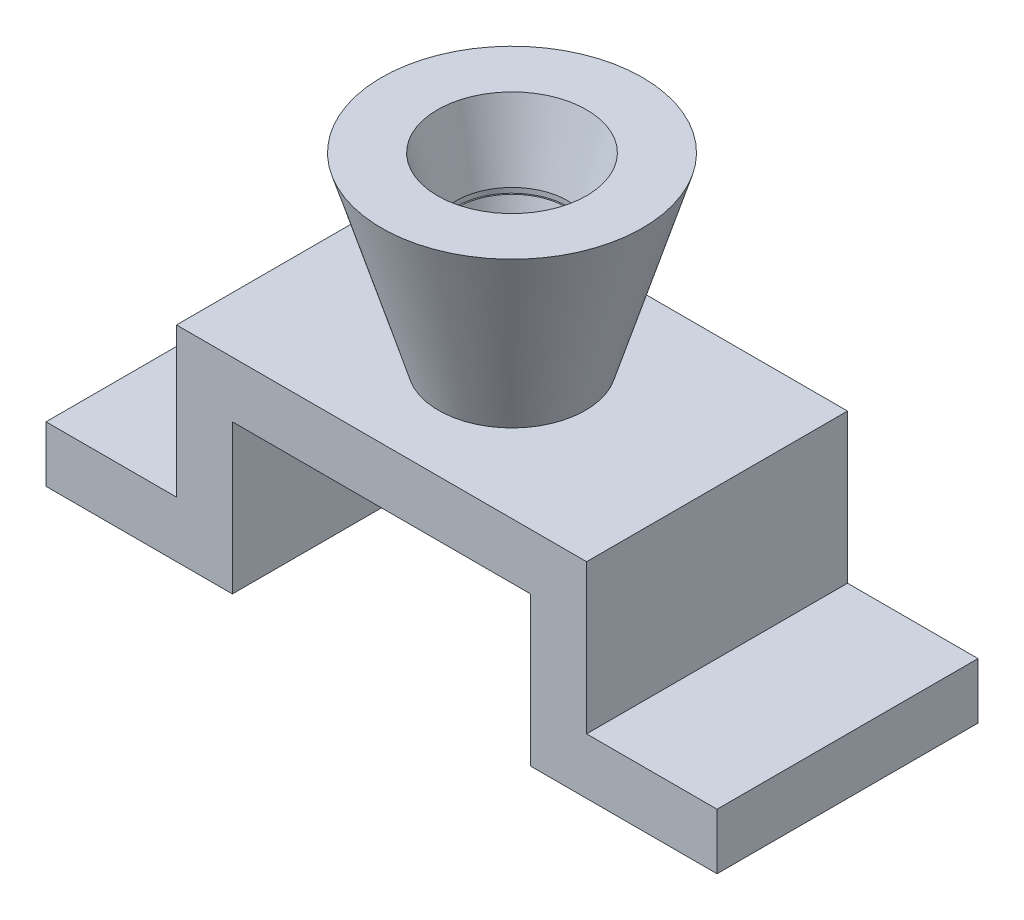
ISO-10303-21;
HEADER;
FILE_DESCRIPTION(('STEP AP214'),'2;1');
FILE_NAME('part.step','',(''),(''),'','','');
FILE_SCHEMA(('AUTOMOTIVE_DESIGN { 1 0 10303 214 1 1 1 1 }'));
ENDSEC;
DATA;
#1=APPLICATION_CONTEXT('core data for automotive mechanical design processes');
#2=APPLICATION_PROTOCOL_DEFINITION('international standard','automotive_design',2000,#1);
#3=PRODUCT_CONTEXT('',#1,'mechanical');
#4=PRODUCT('Part','Part','',(#3));
#5=PRODUCT_RELATED_PRODUCT_CATEGORY('part','',(#4));
#6=PRODUCT_DEFINITION_FORMATION('','',#4);
#7=PRODUCT_DEFINITION_CONTEXT('part definition',#1,'design');
#8=PRODUCT_DEFINITION('design','',#6,#7);
#9=PRODUCT_DEFINITION_SHAPE('','',#8);
#10=(LENGTH_UNIT() NAMED_UNIT(*) SI_UNIT(.MILLI.,.METRE.));
#11=(NAMED_UNIT(*) PLANE_ANGLE_UNIT() SI_UNIT($,.RADIAN.));
#12=(NAMED_UNIT(*) SI_UNIT($,.STERADIAN.) SOLID_ANGLE_UNIT());
#13=UNCERTAINTY_MEASURE_WITH_UNIT(LENGTH_MEASURE(1.E-05),#10,'distance_accuracy_value','');
#14=(GEOMETRIC_REPRESENTATION_CONTEXT(3) GLOBAL_UNCERTAINTY_ASSIGNED_CONTEXT((#13)) GLOBAL_UNIT_ASSIGNED_CONTEXT((#10,
#11,#12)) REPRESENTATION_CONTEXT('',''));
#15=CARTESIAN_POINT('',(0.,0.,0.));
#16=DIRECTION('',(0.,0.,1.));
#17=DIRECTION('',(1.,0.,0.));
#18=AXIS2_PLACEMENT_3D('',#15,#16,#17);
#19=CARTESIAN_POINT('',(-40.,0.,-35.));
#20=DIRECTION('',(0.,-1.,0.));
#21=DIRECTION('',(1.,0.,0.));
#22=AXIS2_PLACEMENT_3D('',#19,#20,#21);
#23=PLANE('',#22);
#24=DIRECTION('',(0.,0.,1.));
#25=VECTOR('',#24,1.);
#26=CARTESIAN_POINT('',(-40.,0.,-35.));
#27=LINE('',#26,#25);
#28=CARTESIAN_POINT('',(-40.,0.,-35.));
#29=VERTEX_POINT('',#28);
#30=CARTESIAN_POINT('',(-40.,0.,35.));
#31=VERTEX_POINT('',#30);
#32=EDGE_CURVE('E132',#29,#31,#27,.T.);
#33=ORIENTED_EDGE('',*,*,#32,.T.);
#34=DIRECTION('',(1.,0.,0.));
#35=VECTOR('',#34,1.);
#36=CARTESIAN_POINT('',(-40.,0.,35.));
#37=LINE('',#36,#35);
#38=CARTESIAN_POINT('',(-90.,0.,35.));
#39=VERTEX_POINT('',#38);
#40=EDGE_CURVE('E135',#39,#31,#37,.T.);
#41=ORIENTED_EDGE('',*,*,#40,.F.);
#42=DIRECTION('',(0.,0.,1.));
#43=VECTOR('',#42,1.);
#44=CARTESIAN_POINT('',(-90.,0.,-35.));
#45=LINE('',#44,#43);
#46=CARTESIAN_POINT('',(-90.,0.,-35.));
#47=VERTEX_POINT('',#46);
#48=EDGE_CURVE('E11',#47,#39,#45,.T.);
#49=ORIENTED_EDGE('',*,*,#48,.F.);
#50=DIRECTION('',(1.,0.,0.));
#51=VECTOR('',#50,1.);
#52=CARTESIAN_POINT('',(-40.,0.,-35.));
#53=LINE('',#52,#51);
#54=EDGE_CURVE('E136',#47,#29,#53,.T.);
#55=ORIENTED_EDGE('',*,*,#54,.T.);
#56=EDGE_LOOP('',(#33,#41,#49,#55));
#57=FACE_BOUND('',#56,.T.);
#58=ADVANCED_FACE('F45',(#57),#23,.T.);
#59=CARTESIAN_POINT('',(-90.,0.,-35.));
#60=DIRECTION('',(-1.,0.,0.));
#61=DIRECTION('',(0.,0.,1.));
#62=AXIS2_PLACEMENT_3D('',#59,#60,#61);
#63=PLANE('',#62);
#64=ORIENTED_EDGE('',*,*,#48,.T.);
#65=DIRECTION('',(0.,-1.,0.));
#66=VECTOR('',#65,1.);
#67=CARTESIAN_POINT('',(-90.,0.,35.));
#68=LINE('',#67,#66);
#69=CARTESIAN_POINT('',(-90.,15.,35.));
#70=VERTEX_POINT('',#69);
#71=EDGE_CURVE('E155',#70,#39,#68,.T.);
#72=ORIENTED_EDGE('',*,*,#71,.F.);
#73=DIRECTION('',(0.,0.,1.));
#74=VECTOR('',#73,1.);
#75=CARTESIAN_POINT('',(-90.,15.,-35.));
#76=LINE('',#75,#74);
#77=CARTESIAN_POINT('',(-90.,15.,-35.));
#78=VERTEX_POINT('',#77);
#79=EDGE_CURVE('E54',#78,#70,#76,.T.);
#80=ORIENTED_EDGE('',*,*,#79,.F.);
#81=DIRECTION('',(0.,-1.,0.));
#82=VECTOR('',#81,1.);
#83=CARTESIAN_POINT('',(-90.,0.,-35.));
#84=LINE('',#83,#82);
#85=EDGE_CURVE('E142',#78,#47,#84,.T.);
#86=ORIENTED_EDGE('',*,*,#85,.T.);
#87=EDGE_LOOP('',(#64,#72,#80,#86));
#88=FACE_BOUND('',#87,.T.);
#89=ADVANCED_FACE('F307',(#88),#63,.T.);
#90=CARTESIAN_POINT('',(-90.,15.,-35.));
#91=DIRECTION('',(0.,1.,0.));
#92=DIRECTION('',(0.,0.,1.));
#93=AXIS2_PLACEMENT_3D('',#90,#91,#92);
#94=PLANE('',#93);
#95=ORIENTED_EDGE('',*,*,#79,.T.);
#96=DIRECTION('',(-1.,0.,0.));
#97=VECTOR('',#96,1.);
#98=CARTESIAN_POINT('',(-90.,15.,35.));
#99=LINE('',#98,#97);
#100=CARTESIAN_POINT('',(-55.,15.,35.));
#101=VERTEX_POINT('',#100);
#102=EDGE_CURVE('E195',#101,#70,#99,.T.);
#103=ORIENTED_EDGE('',*,*,#102,.F.);
#104=DIRECTION('',(0.,0.,1.));
#105=VECTOR('',#104,1.);
#106=CARTESIAN_POINT('',(-55.,15.,-35.));
#107=LINE('',#106,#105);
#108=CARTESIAN_POINT('',(-55.,15.,-35.));
#109=VERTEX_POINT('',#108);
#110=EDGE_CURVE('E244',#109,#101,#107,.T.);
#111=ORIENTED_EDGE('',*,*,#110,.F.);
#112=DIRECTION('',(-1.,0.,0.));
#113=VECTOR('',#112,1.);
#114=CARTESIAN_POINT('',(-90.,15.,-35.));
#115=LINE('',#114,#113);
#116=EDGE_CURVE('E237',#109,#78,#115,.T.);
#117=ORIENTED_EDGE('',*,*,#116,.T.);
#118=EDGE_LOOP('',(#95,#103,#111,#117));
#119=FACE_BOUND('',#118,.T.);
#120=ADVANCED_FACE('F305',(#119),#94,.T.);
#121=CARTESIAN_POINT('',(-55.,15.,-35.));
#122=DIRECTION('',(-1.,0.,0.));
#123=DIRECTION('',(0.,0.,1.));
#124=AXIS2_PLACEMENT_3D('',#121,#122,#123);
#125=PLANE('',#124);
#126=ORIENTED_EDGE('',*,*,#110,.T.);
#127=DIRECTION('',(0.,-1.,0.));
#128=VECTOR('',#127,1.);
#129=CARTESIAN_POINT('',(-55.,15.,35.));
#130=LINE('',#129,#128);
#131=CARTESIAN_POINT('',(-55.,55.,35.));
#132=VERTEX_POINT('',#131);
#133=EDGE_CURVE('E191',#132,#101,#130,.T.);
#134=ORIENTED_EDGE('',*,*,#133,.F.);
#135=DIRECTION('',(0.,0.,1.));
#136=VECTOR('',#135,1.);
#137=CARTESIAN_POINT('',(-55.,55.,-35.));
#138=LINE('',#137,#136);
#139=CARTESIAN_POINT('',(-55.,55.,-35.));
#140=VERTEX_POINT('',#139);
#141=EDGE_CURVE('E247',#140,#132,#138,.T.);
#142=ORIENTED_EDGE('',*,*,#141,.F.);
#143=DIRECTION('',(0.,-1.,0.));
#144=VECTOR('',#143,1.);
#145=CARTESIAN_POINT('',(-55.,15.,-35.));
#146=LINE('',#145,#144);
#147=EDGE_CURVE('E233',#140,#109,#146,.T.);
#148=ORIENTED_EDGE('',*,*,#147,.T.);
#149=EDGE_LOOP('',(#126,#134,#142,#148));
#150=FACE_BOUND('',#149,.T.);
#151=ADVANCED_FACE('F303',(#150),#125,.T.);
#152=CARTESIAN_POINT('',(-55.,55.,-35.));
#153=DIRECTION('',(0.,1.,0.));
#154=DIRECTION('',(0.,0.,1.));
#155=AXIS2_PLACEMENT_3D('',#152,#153,#154);
#156=PLANE('',#155);
#157=CARTESIAN_POINT('',(0.,55.,0.));
#158=DIRECTION('',(0.,-1.,0.));
#159=DIRECTION('',(0.,0.,-1.));
#160=AXIS2_PLACEMENT_3D('',#157,#158,#159);
#161=CIRCLE('',#160,19.7134659270671);
#162=CARTESIAN_POINT('',(0.,55.,-19.7134659270671));
#163=VERTEX_POINT('',#162);
#164=EDGE_CURVE('E161',#163,#163,#161,.T.);
#165=ORIENTED_EDGE('',*,*,#164,.T.);
#166=EDGE_LOOP('',(#165));
#167=FACE_BOUND('',#166,.T.);
#168=ORIENTED_EDGE('',*,*,#141,.T.);
#169=DIRECTION('',(-1.,0.,0.));
#170=VECTOR('',#169,1.);
#171=CARTESIAN_POINT('',(-55.,55.,35.));
#172=LINE('',#171,#170);
#173=CARTESIAN_POINT('',(55.,55.,35.));
#174=VERTEX_POINT('',#173);
#175=EDGE_CURVE('E187',#174,#132,#172,.T.);
#176=ORIENTED_EDGE('',*,*,#175,.F.);
#177=DIRECTION('',(0.,0.,1.));
#178=VECTOR('',#177,1.);
#179=CARTESIAN_POINT('',(55.,55.,-35.));
#180=LINE('',#179,#178);
#181=CARTESIAN_POINT('',(55.,55.,-35.));
#182=VERTEX_POINT('',#181);
#183=EDGE_CURVE('E250',#182,#174,#180,.T.);
#184=ORIENTED_EDGE('',*,*,#183,.F.);
#185=DIRECTION('',(-1.,0.,0.));
#186=VECTOR('',#185,1.);
#187=CARTESIAN_POINT('',(-55.,55.,-35.));
#188=LINE('',#187,#186);
#189=EDGE_CURVE('E229',#182,#140,#188,.T.);
#190=ORIENTED_EDGE('',*,*,#189,.T.);
#191=EDGE_LOOP('',(#168,#176,#184,#190));
#192=FACE_BOUND('',#191,.T.);
#193=ADVANCED_FACE('F298',(#167,#192),#156,.T.);
#194=CARTESIAN_POINT('',(55.,55.,-35.));
#195=DIRECTION('',(1.,0.,0.));
#196=DIRECTION('',(0.,1.,0.));
#197=AXIS2_PLACEMENT_3D('',#194,#195,#196);
#198=PLANE('',#197);
#199=ORIENTED_EDGE('',*,*,#183,.T.);
#200=DIRECTION('',(0.,1.,0.));
#201=VECTOR('',#200,1.);
#202=CARTESIAN_POINT('',(55.,55.,35.));
#203=LINE('',#202,#201);
#204=CARTESIAN_POINT('',(55.,15.,35.));
#205=VERTEX_POINT('',#204);
#206=EDGE_CURVE('E183',#205,#174,#203,.T.);
#207=ORIENTED_EDGE('',*,*,#206,.F.);
#208=DIRECTION('',(0.,0.,1.));
#209=VECTOR('',#208,1.);
#210=CARTESIAN_POINT('',(55.,15.,-35.));
#211=LINE('',#210,#209);
#212=CARTESIAN_POINT('',(55.,15.,-35.));
#213=VERTEX_POINT('',#212);
#214=EDGE_CURVE('E253',#213,#205,#211,.T.);
#215=ORIENTED_EDGE('',*,*,#214,.F.);
#216=DIRECTION('',(0.,1.,0.));
#217=VECTOR('',#216,1.);
#218=CARTESIAN_POINT('',(55.,55.,-35.));
#219=LINE('',#218,#217);
#220=EDGE_CURVE('E225',#213,#182,#219,.T.);
#221=ORIENTED_EDGE('',*,*,#220,.T.);
#222=EDGE_LOOP('',(#199,#207,#215,#221));
#223=FACE_BOUND('',#222,.T.);
#224=ADVANCED_FACE('F293',(#223),#198,.T.);
#225=CARTESIAN_POINT('',(55.,15.,-35.));
#226=DIRECTION('',(0.,1.,0.));
#227=DIRECTION('',(0.,0.,1.));
#228=AXIS2_PLACEMENT_3D('',#225,#226,#227);
#229=PLANE('',#228);
#230=ORIENTED_EDGE('',*,*,#214,.T.);
#231=DIRECTION('',(-1.,0.,0.));
#232=VECTOR('',#231,1.);
#233=CARTESIAN_POINT('',(55.,15.,35.));
#234=LINE('',#233,#232);
#235=CARTESIAN_POINT('',(90.,15.,35.));
#236=VERTEX_POINT('',#235);
#237=EDGE_CURVE('E179',#236,#205,#234,.T.);
#238=ORIENTED_EDGE('',*,*,#237,.F.);
#239=DIRECTION('',(0.,0.,1.));
#240=VECTOR('',#239,1.);
#241=CARTESIAN_POINT('',(90.,15.,-35.));
#242=LINE('',#241,#240);
#243=CARTESIAN_POINT('',(90.,15.,-35.));
#244=VERTEX_POINT('',#243);
#245=EDGE_CURVE('E256',#244,#236,#242,.T.);
#246=ORIENTED_EDGE('',*,*,#245,.F.);
#247=DIRECTION('',(-1.,0.,0.));
#248=VECTOR('',#247,1.);
#249=CARTESIAN_POINT('',(55.,15.,-35.));
#250=LINE('',#249,#248);
#251=EDGE_CURVE('E221',#244,#213,#250,.T.);
#252=ORIENTED_EDGE('',*,*,#251,.T.);
#253=EDGE_LOOP('',(#230,#238,#246,#252));
#254=FACE_BOUND('',#253,.T.);
#255=ADVANCED_FACE('F291',(#254),#229,.T.);
#256=CARTESIAN_POINT('',(90.,15.,-35.));
#257=DIRECTION('',(1.,0.,0.));
#258=DIRECTION('',(0.,0.,-1.));
#259=AXIS2_PLACEMENT_3D('',#256,#257,#258);
#260=PLANE('',#259);
#261=ORIENTED_EDGE('',*,*,#245,.T.);
#262=DIRECTION('',(0.,1.,0.));
#263=VECTOR('',#262,1.);
#264=CARTESIAN_POINT('',(90.,15.,35.));
#265=LINE('',#264,#263);
#266=CARTESIAN_POINT('',(90.,0.,35.));
#267=VERTEX_POINT('',#266);
#268=EDGE_CURVE('E175',#267,#236,#265,.T.);
#269=ORIENTED_EDGE('',*,*,#268,.F.);
#270=DIRECTION('',(0.,0.,1.));
#271=VECTOR('',#270,1.);
#272=CARTESIAN_POINT('',(90.,0.,-35.));
#273=LINE('',#272,#271);
#274=CARTESIAN_POINT('',(90.,0.,-35.));
#275=VERTEX_POINT('',#274);
#276=EDGE_CURVE('E259',#275,#267,#273,.T.);
#277=ORIENTED_EDGE('',*,*,#276,.F.);
#278=DIRECTION('',(0.,1.,0.));
#279=VECTOR('',#278,1.);
#280=CARTESIAN_POINT('',(90.,15.,-35.));
#281=LINE('',#280,#279);
#282=EDGE_CURVE('E217',#275,#244,#281,.T.);
#283=ORIENTED_EDGE('',*,*,#282,.T.);
#284=EDGE_LOOP('',(#261,#269,#277,#283));
#285=FACE_BOUND('',#284,.T.);
#286=ADVANCED_FACE('F286',(#285),#260,.T.);
#287=CARTESIAN_POINT('',(90.,0.,-35.));
#288=DIRECTION('',(0.,-1.,0.));
#289=DIRECTION('',(1.,0.,0.));
#290=AXIS2_PLACEMENT_3D('',#287,#288,#289);
#291=PLANE('',#290);
#292=ORIENTED_EDGE('',*,*,#276,.T.);
#293=DIRECTION('',(1.,0.,0.));
#294=VECTOR('',#293,1.);
#295=CARTESIAN_POINT('',(90.,0.,35.));
#296=LINE('',#295,#294);
#297=CARTESIAN_POINT('',(40.,0.,35.));
#298=VERTEX_POINT('',#297);
#299=EDGE_CURVE('E171',#298,#267,#296,.T.);
#300=ORIENTED_EDGE('',*,*,#299,.F.);
#301=DIRECTION('',(0.,0.,1.));
#302=VECTOR('',#301,1.);
#303=CARTESIAN_POINT('',(40.,0.,-35.));
#304=LINE('',#303,#302);
#305=CARTESIAN_POINT('',(40.,0.,-35.));
#306=VERTEX_POINT('',#305);
#307=EDGE_CURVE('E262',#306,#298,#304,.T.);
#308=ORIENTED_EDGE('',*,*,#307,.F.);
#309=DIRECTION('',(1.,0.,0.));
#310=VECTOR('',#309,1.);
#311=CARTESIAN_POINT('',(90.,0.,-35.));
#312=LINE('',#311,#310);
#313=EDGE_CURVE('E213',#306,#275,#312,.T.);
#314=ORIENTED_EDGE('',*,*,#313,.T.);
#315=EDGE_LOOP('',(#292,#300,#308,#314));
#316=FACE_BOUND('',#315,.T.);
#317=ADVANCED_FACE('F279',(#316),#291,.T.);
#318=CARTESIAN_POINT('',(40.,0.,-35.));
#319=DIRECTION('',(-1.,0.,0.));
#320=DIRECTION('',(0.,0.,1.));
#321=AXIS2_PLACEMENT_3D('',#318,#319,#320);
#322=PLANE('',#321);
#323=ORIENTED_EDGE('',*,*,#307,.T.);
#324=DIRECTION('',(0.,-1.,0.));
#325=VECTOR('',#324,1.);
#326=CARTESIAN_POINT('',(40.,0.,35.));
#327=LINE('',#326,#325);
#328=CARTESIAN_POINT('',(40.,40.,35.));
#329=VERTEX_POINT('',#328);
#330=EDGE_CURVE('E167',#329,#298,#327,.T.);
#331=ORIENTED_EDGE('',*,*,#330,.F.);
#332=DIRECTION('',(0.,0.,1.));
#333=VECTOR('',#332,1.);
#334=CARTESIAN_POINT('',(40.,40.,-35.));
#335=LINE('',#334,#333);
#336=CARTESIAN_POINT('',(40.,40.,-35.));
#337=VERTEX_POINT('',#336);
#338=EDGE_CURVE('E265',#337,#329,#335,.T.);
#339=ORIENTED_EDGE('',*,*,#338,.F.);
#340=DIRECTION('',(0.,-1.,0.));
#341=VECTOR('',#340,1.);
#342=CARTESIAN_POINT('',(40.,0.,-35.));
#343=LINE('',#342,#341);
#344=EDGE_CURVE('E209',#337,#306,#343,.T.);
#345=ORIENTED_EDGE('',*,*,#344,.T.);
#346=EDGE_LOOP('',(#323,#331,#339,#345));
#347=FACE_BOUND('',#346,.T.);
#348=ADVANCED_FACE('F276',(#347),#322,.T.);
#349=CARTESIAN_POINT('',(40.,40.,-35.));
#350=DIRECTION('',(0.,-1.,0.));
#351=DIRECTION('',(0.,0.,-1.));
#352=AXIS2_PLACEMENT_3D('',#349,#350,#351);
#353=PLANE('',#352);
#354=CARTESIAN_POINT('',(0.,40.,0.));
#355=DIRECTION('',(0.,-1.,0.));
#356=DIRECTION('',(0.,0.,-1.));
#357=AXIS2_PLACEMENT_3D('',#354,#355,#356);
#358=CIRCLE('',#357,8.);
#359=CARTESIAN_POINT('',(0.,40.,-8.));
#360=VERTEX_POINT('',#359);
#361=EDGE_CURVE('E385',#360,#360,#358,.T.);
#362=ORIENTED_EDGE('',*,*,#361,.F.);
#363=EDGE_LOOP('',(#362));
#364=FACE_BOUND('',#363,.T.);
#365=ORIENTED_EDGE('',*,*,#338,.T.);
#366=DIRECTION('',(1.,0.,0.));
#367=VECTOR('',#366,1.);
#368=CARTESIAN_POINT('',(40.,40.,35.));
#369=LINE('',#368,#367);
#370=CARTESIAN_POINT('',(-40.,40.,35.));
#371=VERTEX_POINT('',#370);
#372=EDGE_CURVE('E150',#371,#329,#369,.T.);
#373=ORIENTED_EDGE('',*,*,#372,.F.);
#374=DIRECTION('',(0.,0.,1.));
#375=VECTOR('',#374,1.);
#376=CARTESIAN_POINT('',(-40.,40.,-35.));
#377=LINE('',#376,#375);
#378=CARTESIAN_POINT('',(-40.,40.,-35.));
#379=VERTEX_POINT('',#378);
#380=EDGE_CURVE('E141',#379,#371,#377,.T.);
#381=ORIENTED_EDGE('',*,*,#380,.F.);
#382=DIRECTION('',(1.,0.,0.));
#383=VECTOR('',#382,1.);
#384=CARTESIAN_POINT('',(40.,40.,-35.));
#385=LINE('',#384,#383);
#386=EDGE_CURVE('E205',#379,#337,#385,.T.);
#387=ORIENTED_EDGE('',*,*,#386,.T.);
#388=EDGE_LOOP('',(#365,#373,#381,#387));
#389=FACE_BOUND('',#388,.T.);
#390=ADVANCED_FACE('F270',(#364,#389),#353,.T.);
#391=CARTESIAN_POINT('',(-40.,40.,-35.));
#392=DIRECTION('',(1.,0.,0.));
#393=DIRECTION('',(0.,0.,-1.));
#394=AXIS2_PLACEMENT_3D('',#391,#392,#393);
#395=PLANE('',#394);
#396=ORIENTED_EDGE('',*,*,#380,.T.);
#397=DIRECTION('',(0.,1.,0.));
#398=VECTOR('',#397,1.);
#399=CARTESIAN_POINT('',(-40.,40.,35.));
#400=LINE('',#399,#398);
#401=EDGE_CURVE('E144',#31,#371,#400,.T.);
#402=ORIENTED_EDGE('',*,*,#401,.F.);
#403=ORIENTED_EDGE('',*,*,#32,.F.);
#404=DIRECTION('',(0.,1.,0.));
#405=VECTOR('',#404,1.);
#406=CARTESIAN_POINT('',(-40.,40.,-35.));
#407=LINE('',#406,#405);
#408=EDGE_CURVE('E202',#29,#379,#407,.T.);
#409=ORIENTED_EDGE('',*,*,#408,.T.);
#410=EDGE_LOOP('',(#396,#402,#403,#409));
#411=FACE_BOUND('',#410,.T.);
#412=ADVANCED_FACE('F145',(#411),#395,.T.);
#413=CARTESIAN_POINT('',(0.,0.,-35.));
#414=DIRECTION('',(0.,0.,-1.));
#415=DIRECTION('',(-1.,0.,0.));
#416=AXIS2_PLACEMENT_3D('',#413,#414,#415);
#417=PLANE('',#416);
#418=ORIENTED_EDGE('',*,*,#54,.F.);
#419=ORIENTED_EDGE('',*,*,#85,.F.);
#420=ORIENTED_EDGE('',*,*,#116,.F.);
#421=ORIENTED_EDGE('',*,*,#147,.F.);
#422=ORIENTED_EDGE('',*,*,#189,.F.);
#423=ORIENTED_EDGE('',*,*,#220,.F.);
#424=ORIENTED_EDGE('',*,*,#251,.F.);
#425=ORIENTED_EDGE('',*,*,#282,.F.);
#426=ORIENTED_EDGE('',*,*,#313,.F.);
#427=ORIENTED_EDGE('',*,*,#344,.F.);
#428=ORIENTED_EDGE('',*,*,#386,.F.);
#429=ORIENTED_EDGE('',*,*,#408,.F.);
#430=EDGE_LOOP('',(#418,#419,#420,#421,#422,#423,#424,#425,#426,#427,#428,#429));
#431=FACE_BOUND('',#430,.T.);
#432=ADVANCED_FACE('F282',(#431),#417,.T.);
#433=CARTESIAN_POINT('',(0.,0.,35.));
#434=DIRECTION('',(0.,0.,-1.));
#435=DIRECTION('',(-1.,0.,0.));
#436=AXIS2_PLACEMENT_3D('',#433,#434,#435);
#437=PLANE('',#436);
#438=ORIENTED_EDGE('',*,*,#40,.T.);
#439=ORIENTED_EDGE('',*,*,#401,.T.);
#440=ORIENTED_EDGE('',*,*,#372,.T.);
#441=ORIENTED_EDGE('',*,*,#330,.T.);
#442=ORIENTED_EDGE('',*,*,#299,.T.);
#443=ORIENTED_EDGE('',*,*,#268,.T.);
#444=ORIENTED_EDGE('',*,*,#237,.T.);
#445=ORIENTED_EDGE('',*,*,#206,.T.);
#446=ORIENTED_EDGE('',*,*,#175,.T.);
#447=ORIENTED_EDGE('',*,*,#133,.T.);
#448=ORIENTED_EDGE('',*,*,#102,.T.);
#449=ORIENTED_EDGE('',*,*,#71,.T.);
#450=EDGE_LOOP('',(#438,#439,#440,#441,#442,#443,#444,#445,#446,#447,#448,#449));
#451=FACE_BOUND('',#450,.T.);
#452=ADVANCED_FACE('F153',(#451),#437,.F.);
#453=CARTESIAN_POINT('',(0.,105.,0.));
#454=DIRECTION('',(0.,1.,0.));
#455=DIRECTION('',(0.,0.,1.));
#456=AXIS2_PLACEMENT_3D('',#453,#454,#455);
#457=PLANE('',#456);
#458=CARTESIAN_POINT('',(0.,105.,0.));
#459=DIRECTION('',(0.,1.,0.));
#460=DIRECTION('',(0.,0.,1.));
#461=AXIS2_PLACEMENT_3D('',#458,#459,#460);
#462=CIRCLE('',#461,20.);
#463=CARTESIAN_POINT('',(0.,105.,20.));
#464=VERTEX_POINT('',#463);
#465=EDGE_CURVE('E380',#464,#464,#462,.T.);
#466=ORIENTED_EDGE('',*,*,#465,.F.);
#467=EDGE_LOOP('',(#466));
#468=FACE_BOUND('',#467,.T.);
#469=CARTESIAN_POINT('',(0.,105.,0.));
#470=DIRECTION('',(0.,-1.,0.));
#471=DIRECTION('',(0.,0.,-1.));
#472=AXIS2_PLACEMENT_3D('',#469,#470,#471);
#473=CIRCLE('',#472,35.);
#474=CARTESIAN_POINT('',(0.,105.,-35.));
#475=VERTEX_POINT('',#474);
#476=EDGE_CURVE('E157',#475,#475,#473,.T.);
#477=ORIENTED_EDGE('',*,*,#476,.F.);
#478=EDGE_LOOP('',(#477));
#479=FACE_BOUND('',#478,.T.);
#480=ADVANCED_FACE('F342',(#468,#479),#457,.T.);
#481=CARTESIAN_POINT('',(0.,55.,0.));
#482=DIRECTION('',(0.,1.,0.));
#483=DIRECTION('',(0.,0.,1.));
#484=AXIS2_PLACEMENT_3D('',#481,#482,#483);
#485=CONICAL_SURFACE('',#484,19.7134659270671,0.296705972839033);
#486=ORIENTED_EDGE('',*,*,#476,.T.);
#487=EDGE_LOOP('',(#486));
#488=FACE_BOUND('',#487,.T.);
#489=ORIENTED_EDGE('',*,*,#164,.F.);
#490=EDGE_LOOP('',(#489));
#491=FACE_BOUND('',#490,.T.);
#492=ADVANCED_FACE('F346',(#488,#491),#485,.T.);
#493=CARTESIAN_POINT('',(0.,105.,0.));
#494=DIRECTION('',(0.,1.,0.));
#495=DIRECTION('',(0.,0.,1.));
#496=AXIS2_PLACEMENT_3D('',#493,#494,#495);
#497=CYLINDRICAL_SURFACE('',#496,8.);
#498=CARTESIAN_POINT('',(0.,60.2153903091736,0.));
#499=DIRECTION('',(0.,1.,0.));
#500=DIRECTION('',(0.,0.,1.));
#501=AXIS2_PLACEMENT_3D('',#498,#499,#500);
#502=CIRCLE('',#501,8.00000000000001);
#503=CARTESIAN_POINT('',(0.,60.2153903091736,8.00000000000001));
#504=VERTEX_POINT('',#503);
#505=EDGE_CURVE('E392',#504,#504,#502,.T.);
#506=ORIENTED_EDGE('',*,*,#505,.T.);
#507=EDGE_LOOP('',(#506));
#508=FACE_BOUND('',#507,.T.);
#509=ORIENTED_EDGE('',*,*,#361,.T.);
#510=EDGE_LOOP('',(#509));
#511=FACE_BOUND('',#510,.T.);
#512=ADVANCED_FACE('F352',(#508,#511),#497,.F.);
#513=CARTESIAN_POINT('',(0.,105.,0.));
#514=DIRECTION('',(0.,1.,0.));
#515=DIRECTION('',(0.,0.,1.));
#516=AXIS2_PLACEMENT_3D('',#513,#514,#515);
#517=CONICAL_SURFACE('',#516,20.,0.26179938779915);
#518=ORIENTED_EDGE('',*,*,#505,.F.);
#519=EDGE_LOOP('',(#518));
#520=FACE_BOUND('',#519,.T.);
#521=CARTESIAN_POINT('',(0.,85.,0.));
#522=DIRECTION('',(0.,-1.,0.));
#523=DIRECTION('',(0.,0.,-1.));
#524=AXIS2_PLACEMENT_3D('',#521,#522,#523);
#525=CIRCLE('',#524,14.6410161513775);
#526=CARTESIAN_POINT('',(0.,85.,-14.6410161513775));
#527=VERTEX_POINT('',#526);
#528=EDGE_CURVE('E384',#527,#527,#525,.T.);
#529=ORIENTED_EDGE('',*,*,#528,.F.);
#530=EDGE_LOOP('',(#529));
#531=FACE_BOUND('',#530,.T.);
#532=ADVANCED_FACE('F362',(#520,#531),#517,.F.);
#533=CARTESIAN_POINT('',(0.,105.,0.));
#534=DIRECTION('',(0.,1.,0.));
#535=DIRECTION('',(0.,0.,1.));
#536=AXIS2_PLACEMENT_3D('',#533,#534,#535);
#537=CYLINDRICAL_SURFACE('',#536,15.);
#538=CARTESIAN_POINT('',(0.,86.3397459621557,0.));
#539=DIRECTION('',(0.,1.,0.));
#540=DIRECTION('',(0.,0.,1.));
#541=AXIS2_PLACEMENT_3D('',#538,#539,#540);
#542=CIRCLE('',#541,15.);
#543=CARTESIAN_POINT('',(0.,86.3397459621557,15.));
#544=VERTEX_POINT('',#543);
#545=EDGE_CURVE('E48',#544,#544,#542,.T.);
#546=ORIENTED_EDGE('',*,*,#545,.T.);
#547=EDGE_LOOP('',(#546));
#548=FACE_BOUND('',#547,.T.);
#549=CARTESIAN_POINT('',(0.,85.,0.));
#550=DIRECTION('',(0.,1.,0.));
#551=DIRECTION('',(0.,0.,1.));
#552=AXIS2_PLACEMENT_3D('',#549,#550,#551);
#553=CIRCLE('',#552,15.);
#554=CARTESIAN_POINT('',(0.,85.,15.));
#555=VERTEX_POINT('',#554);
#556=EDGE_CURVE('E389',#555,#555,#553,.T.);
#557=ORIENTED_EDGE('',*,*,#556,.F.);
#558=EDGE_LOOP('',(#557));
#559=FACE_BOUND('',#558,.T.);
#560=ADVANCED_FACE('F358',(#548,#559),#537,.F.);
#561=CARTESIAN_POINT('',(0.,85.,0.));
#562=DIRECTION('',(0.,-1.,0.));
#563=DIRECTION('',(0.,0.,-1.));
#564=AXIS2_PLACEMENT_3D('',#561,#562,#563);
#565=PLANE('',#564);
#566=ORIENTED_EDGE('',*,*,#528,.T.);
#567=EDGE_LOOP('',(#566));
#568=FACE_BOUND('',#567,.T.);
#569=ORIENTED_EDGE('',*,*,#556,.T.);
#570=EDGE_LOOP('',(#569));
#571=FACE_BOUND('',#570,.T.);
#572=ADVANCED_FACE('F354',(#568,#571),#565,.F.);
#573=ORIENTED_EDGE('',*,*,#465,.T.);
#574=EDGE_LOOP('',(#573));
#575=FACE_BOUND('',#574,.T.);
#576=ORIENTED_EDGE('',*,*,#545,.F.);
#577=EDGE_LOOP('',(#576));
#578=FACE_BOUND('',#577,.T.);
#579=ADVANCED_FACE('F357',(#575,#578),#517,.F.);
#580=CLOSED_SHELL('',(#58,#89,#120,#151,#193,#224,#255,#286,#317,#348,#390,#412,#432,#452,#480,
#492,#512,#532,#560,#572,#579));
#581=MANIFOLD_SOLID_BREP('B2',#580);
#582=ADVANCED_BREP_SHAPE_REPRESENTATION('',(#18,#581),#14);
#583=SHAPE_DEFINITION_REPRESENTATION(#9,#582);
ENDSEC;
END-ISO-10303-21;
